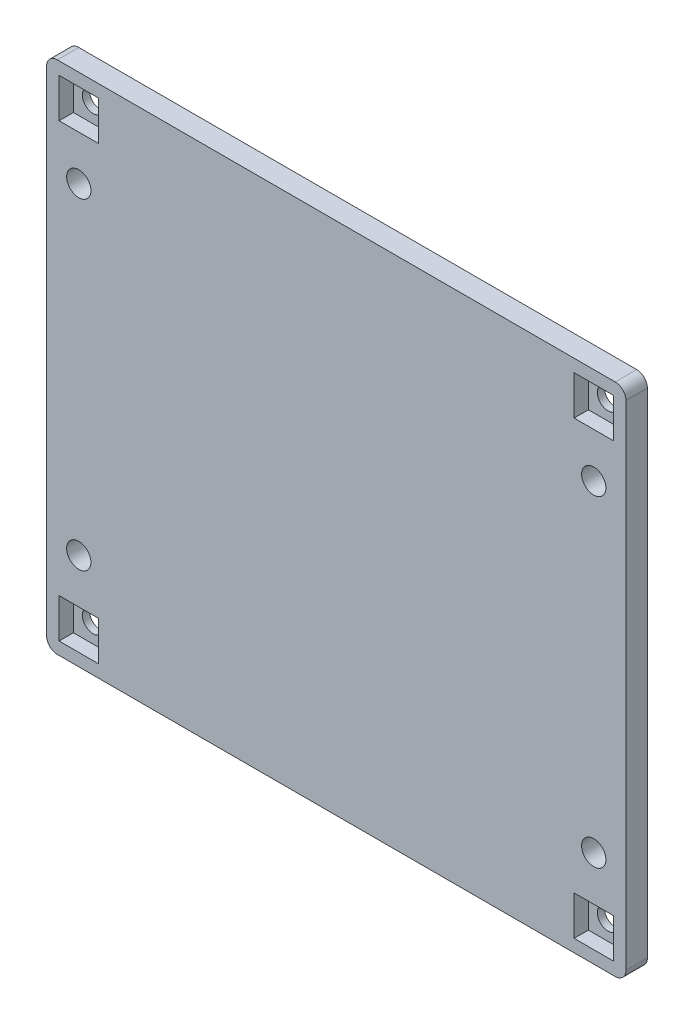
ISO-10303-21;
HEADER;
FILE_DESCRIPTION(('STEP AP214'),'2;1');
FILE_NAME('part.step','',(''),(''),'','','');
FILE_SCHEMA(('AUTOMOTIVE_DESIGN { 1 0 10303 214 1 1 1 1 }'));
ENDSEC;
DATA;
#1=APPLICATION_CONTEXT('core data for automotive mechanical design processes');
#2=APPLICATION_PROTOCOL_DEFINITION('international standard','automotive_design',2000,#1);
#3=PRODUCT_CONTEXT('',#1,'mechanical');
#4=PRODUCT('Part','Part','',(#3));
#5=PRODUCT_RELATED_PRODUCT_CATEGORY('part','',(#4));
#6=PRODUCT_DEFINITION_FORMATION('','',#4);
#7=PRODUCT_DEFINITION_CONTEXT('part definition',#1,'design');
#8=PRODUCT_DEFINITION('design','',#6,#7);
#9=PRODUCT_DEFINITION_SHAPE('','',#8);
#10=(LENGTH_UNIT() NAMED_UNIT(*) SI_UNIT(.MILLI.,.METRE.));
#11=(NAMED_UNIT(*) PLANE_ANGLE_UNIT() SI_UNIT($,.RADIAN.));
#12=(NAMED_UNIT(*) SI_UNIT($,.STERADIAN.) SOLID_ANGLE_UNIT());
#13=UNCERTAINTY_MEASURE_WITH_UNIT(LENGTH_MEASURE(1.E-05),#10,'distance_accuracy_value','');
#14=(GEOMETRIC_REPRESENTATION_CONTEXT(3) GLOBAL_UNCERTAINTY_ASSIGNED_CONTEXT((#13)) GLOBAL_UNIT_ASSIGNED_CONTEXT((#10,
#11,#12)) REPRESENTATION_CONTEXT('',''));
#15=CARTESIAN_POINT('',(0.,0.,0.));
#16=DIRECTION('',(0.,0.,1.));
#17=DIRECTION('',(1.,0.,0.));
#18=AXIS2_PLACEMENT_3D('',#15,#16,#17);
#19=CARTESIAN_POINT('',(82.48303636,231.7459430417,3.));
#20=DIRECTION('',(0.,0.,-1.));
#21=DIRECTION('',(-1.,0.,0.));
#22=AXIS2_PLACEMENT_3D('',#19,#20,#21);
#23=CYLINDRICAL_SURFACE('',#22,1.5);
#24=CARTESIAN_POINT('',(82.48303636,231.7459430417,0.));
#25=DIRECTION('',(0.,0.,1.));
#26=DIRECTION('',(1.,0.,0.));
#27=AXIS2_PLACEMENT_3D('',#24,#25,#26);
#28=CIRCLE('',#27,1.5);
#29=CARTESIAN_POINT('',(83.98303636,231.7459430417,0.));
#30=VERTEX_POINT('',#29);
#31=EDGE_CURVE('E358',#30,#30,#28,.T.);
#32=ORIENTED_EDGE('',*,*,#31,.F.);
#33=EDGE_LOOP('',(#32));
#34=FACE_BOUND('',#33,.T.);
#35=CARTESIAN_POINT('',(82.48303636,231.7459430417,1.));
#36=DIRECTION('',(0.,0.,1.));
#37=DIRECTION('',(1.,0.,0.));
#38=AXIS2_PLACEMENT_3D('',#35,#36,#37);
#39=CIRCLE('',#38,1.5);
#40=CARTESIAN_POINT('',(83.98303636,231.7459430417,1.));
#41=VERTEX_POINT('',#40);
#42=EDGE_CURVE('E37',#41,#41,#39,.T.);
#43=ORIENTED_EDGE('',*,*,#42,.T.);
#44=EDGE_LOOP('',(#43));
#45=FACE_BOUND('',#44,.T.);
#46=ADVANCED_FACE('F33',(#34,#45),#23,.F.);
#47=CARTESIAN_POINT('',(10.478092,294.7486817781,3.));
#48=DIRECTION('',(0.,0.,-1.));
#49=DIRECTION('',(-1.,0.,0.));
#50=AXIS2_PLACEMENT_3D('',#47,#48,#49);
#51=CYLINDRICAL_SURFACE('',#50,1.5);
#52=CARTESIAN_POINT('',(10.478092,294.7486817781,0.));
#53=DIRECTION('',(0.,0.,1.));
#54=DIRECTION('',(1.,0.,0.));
#55=AXIS2_PLACEMENT_3D('',#52,#53,#54);
#56=CIRCLE('',#55,1.5);
#57=CARTESIAN_POINT('',(11.978092,294.7486817781,0.));
#58=VERTEX_POINT('',#57);
#59=EDGE_CURVE('E353',#58,#58,#56,.T.);
#60=ORIENTED_EDGE('',*,*,#59,.F.);
#61=EDGE_LOOP('',(#60));
#62=FACE_BOUND('',#61,.T.);
#63=CARTESIAN_POINT('',(10.478092,294.7486817781,1.));
#64=DIRECTION('',(0.,0.,1.));
#65=DIRECTION('',(1.,0.,0.));
#66=AXIS2_PLACEMENT_3D('',#63,#64,#65);
#67=CIRCLE('',#66,1.5);
#68=CARTESIAN_POINT('',(11.978092,294.7486817781,1.));
#69=VERTEX_POINT('',#68);
#70=EDGE_CURVE('E324',#69,#69,#67,.T.);
#71=ORIENTED_EDGE('',*,*,#70,.T.);
#72=EDGE_LOOP('',(#71));
#73=FACE_BOUND('',#72,.T.);
#74=ADVANCED_FACE('F467',(#62,#73),#51,.F.);
#75=CARTESIAN_POINT('',(7.478092,297.7486817781,3.));
#76=DIRECTION('',(0.,0.,1.));
#77=DIRECTION('',(1.,0.,0.));
#78=AXIS2_PLACEMENT_3D('',#75,#76,#77);
#79=PLANE('',#78);
#80=DIRECTION('',(0.,1.,0.));
#81=VECTOR('',#80,1.);
#82=CARTESIAN_POINT('',(85.23303636,234.4959430417,3.));
#83=LINE('',#82,#81);
#84=CARTESIAN_POINT('',(85.23303636,228.9959430417,3.));
#85=VERTEX_POINT('',#84);
#86=CARTESIAN_POINT('',(85.23303636,234.4959430417,3.));
#87=VERTEX_POINT('',#86);
#88=EDGE_CURVE('E50',#85,#87,#83,.T.);
#89=ORIENTED_EDGE('',*,*,#88,.F.);
#90=DIRECTION('',(1.,0.,0.));
#91=VECTOR('',#90,1.);
#92=CARTESIAN_POINT('',(79.73303636,228.9959430417,3.));
#93=LINE('',#92,#91);
#94=CARTESIAN_POINT('',(79.73303636,228.9959430417,3.));
#95=VERTEX_POINT('',#94);
#96=EDGE_CURVE('E216',#95,#85,#93,.T.);
#97=ORIENTED_EDGE('',*,*,#96,.F.);
#98=DIRECTION('',(0.,-1.,0.));
#99=VECTOR('',#98,1.);
#100=CARTESIAN_POINT('',(79.73303636,234.4959430417,3.));
#101=LINE('',#100,#99);
#102=CARTESIAN_POINT('',(79.73303636,234.4959430417,3.));
#103=VERTEX_POINT('',#102);
#104=EDGE_CURVE('E219',#103,#95,#101,.T.);
#105=ORIENTED_EDGE('',*,*,#104,.F.);
#106=DIRECTION('',(-1.,0.,0.));
#107=VECTOR('',#106,1.);
#108=CARTESIAN_POINT('',(79.73303636,234.4959430417,3.));
#109=LINE('',#108,#107);
#110=EDGE_CURVE('E225',#87,#103,#109,.T.);
#111=ORIENTED_EDGE('',*,*,#110,.F.);
#112=EDGE_LOOP('',(#89,#97,#105,#111));
#113=FACE_BOUND('',#112,.T.);
#114=DIRECTION('',(0.,-1.,0.));
#115=VECTOR('',#114,1.);
#116=CARTESIAN_POINT('',(7.72809199999999,234.4959430417,3.));
#117=LINE('',#116,#115);
#118=CARTESIAN_POINT('',(7.72809199999999,234.4959430417,3.));
#119=VERTEX_POINT('',#118);
#120=CARTESIAN_POINT('',(7.72809199999999,228.9959430417,3.));
#121=VERTEX_POINT('',#120);
#122=EDGE_CURVE('E58',#119,#121,#117,.T.);
#123=ORIENTED_EDGE('',*,*,#122,.F.);
#124=DIRECTION('',(-1.,0.,0.));
#125=VECTOR('',#124,1.);
#126=CARTESIAN_POINT('',(13.228092,234.4959430417,3.));
#127=LINE('',#126,#125);
#128=CARTESIAN_POINT('',(13.228092,234.4959430417,3.));
#129=VERTEX_POINT('',#128);
#130=EDGE_CURVE('E238',#129,#119,#127,.T.);
#131=ORIENTED_EDGE('',*,*,#130,.F.);
#132=DIRECTION('',(0.,1.,0.));
#133=VECTOR('',#132,1.);
#134=CARTESIAN_POINT('',(13.228092,234.4959430417,3.));
#135=LINE('',#134,#133);
#136=CARTESIAN_POINT('',(13.228092,228.9959430417,3.));
#137=VERTEX_POINT('',#136);
#138=EDGE_CURVE('E252',#137,#129,#135,.T.);
#139=ORIENTED_EDGE('',*,*,#138,.F.);
#140=DIRECTION('',(1.,0.,0.));
#141=VECTOR('',#140,1.);
#142=CARTESIAN_POINT('',(13.228092,228.9959430417,3.));
#143=LINE('',#142,#141);
#144=EDGE_CURVE('E249',#121,#137,#143,.T.);
#145=ORIENTED_EDGE('',*,*,#144,.F.);
#146=EDGE_LOOP('',(#123,#131,#139,#145));
#147=FACE_BOUND('',#146,.T.);
#148=DIRECTION('',(0.,-1.,0.));
#149=VECTOR('',#148,1.);
#150=CARTESIAN_POINT('',(79.73303636,297.4986817781,3.));
#151=LINE('',#150,#149);
#152=CARTESIAN_POINT('',(79.73303636,297.4986817781,3.));
#153=VERTEX_POINT('',#152);
#154=CARTESIAN_POINT('',(79.73303636,291.9986817781,3.));
#155=VERTEX_POINT('',#154);
#156=EDGE_CURVE('E279',#153,#155,#151,.T.);
#157=ORIENTED_EDGE('',*,*,#156,.F.);
#158=DIRECTION('',(-1.,0.,0.));
#159=VECTOR('',#158,1.);
#160=CARTESIAN_POINT('',(85.23303636,297.4986817781,3.));
#161=LINE('',#160,#159);
#162=CARTESIAN_POINT('',(85.23303636,297.4986817781,3.));
#163=VERTEX_POINT('',#162);
#164=EDGE_CURVE('E269',#163,#153,#161,.T.);
#165=ORIENTED_EDGE('',*,*,#164,.F.);
#166=DIRECTION('',(0.,1.,0.));
#167=VECTOR('',#166,1.);
#168=CARTESIAN_POINT('',(85.23303636,297.4986817781,3.));
#169=LINE('',#168,#167);
#170=CARTESIAN_POINT('',(85.23303636,291.9986817781,3.));
#171=VERTEX_POINT('',#170);
#172=EDGE_CURVE('E284',#171,#163,#169,.T.);
#173=ORIENTED_EDGE('',*,*,#172,.F.);
#174=DIRECTION('',(1.,0.,0.));
#175=VECTOR('',#174,1.);
#176=CARTESIAN_POINT('',(85.23303636,291.9986817781,3.));
#177=LINE('',#176,#175);
#178=EDGE_CURVE('E281',#155,#171,#177,.T.);
#179=ORIENTED_EDGE('',*,*,#178,.F.);
#180=EDGE_LOOP('',(#157,#165,#173,#179));
#181=FACE_BOUND('',#180,.T.);
#182=DIRECTION('',(0.,1.,0.));
#183=VECTOR('',#182,1.);
#184=CARTESIAN_POINT('',(13.228092,297.4986817781,3.));
#185=LINE('',#184,#183);
#186=CARTESIAN_POINT('',(13.228092,291.9986817781,3.));
#187=VERTEX_POINT('',#186);
#188=CARTESIAN_POINT('',(13.228092,297.4986817781,3.));
#189=VERTEX_POINT('',#188);
#190=EDGE_CURVE('E312',#187,#189,#185,.T.);
#191=ORIENTED_EDGE('',*,*,#190,.F.);
#192=DIRECTION('',(1.,0.,0.));
#193=VECTOR('',#192,1.);
#194=CARTESIAN_POINT('',(7.728092,291.9986817781,3.));
#195=LINE('',#194,#193);
#196=CARTESIAN_POINT('',(7.728092,291.9986817781,3.));
#197=VERTEX_POINT('',#196);
#198=EDGE_CURVE('E302',#197,#187,#195,.T.);
#199=ORIENTED_EDGE('',*,*,#198,.F.);
#200=DIRECTION('',(0.,-1.,0.));
#201=VECTOR('',#200,1.);
#202=CARTESIAN_POINT('',(7.728092,297.4986817781,3.));
#203=LINE('',#202,#201);
#204=CARTESIAN_POINT('',(7.728092,297.4986817781,3.));
#205=VERTEX_POINT('',#204);
#206=EDGE_CURVE('E317',#205,#197,#203,.T.);
#207=ORIENTED_EDGE('',*,*,#206,.F.);
#208=DIRECTION('',(-1.,0.,0.));
#209=VECTOR('',#208,1.);
#210=CARTESIAN_POINT('',(7.728092,297.4986817781,3.));
#211=LINE('',#210,#209);
#212=EDGE_CURVE('E314',#189,#205,#211,.T.);
#213=ORIENTED_EDGE('',*,*,#212,.F.);
#214=EDGE_LOOP('',(#191,#199,#207,#213));
#215=FACE_BOUND('',#214,.T.);
#216=CARTESIAN_POINT('',(82.48303636,240.7456085396,3.));
#217=DIRECTION('',(0.,0.,1.));
#218=DIRECTION('',(1.,0.,0.));
#219=AXIS2_PLACEMENT_3D('',#216,#217,#218);
#220=CIRCLE('',#219,1.69999999999999);
#221=CARTESIAN_POINT('',(84.18303636,240.7456085396,3.));
#222=VERTEX_POINT('',#221);
#223=EDGE_CURVE('E338',#222,#222,#220,.T.);
#224=ORIENTED_EDGE('',*,*,#223,.F.);
#225=EDGE_LOOP('',(#224));
#226=FACE_BOUND('',#225,.T.);
#227=CARTESIAN_POINT('',(10.478092,240.7456085396,3.));
#228=DIRECTION('',(0.,0.,1.));
#229=DIRECTION('',(1.,0.,0.));
#230=AXIS2_PLACEMENT_3D('',#227,#228,#229);
#231=CIRCLE('',#230,1.7);
#232=CARTESIAN_POINT('',(12.178092,240.7456085396,3.));
#233=VERTEX_POINT('',#232);
#234=EDGE_CURVE('E350',#233,#233,#231,.T.);
#235=ORIENTED_EDGE('',*,*,#234,.F.);
#236=EDGE_LOOP('',(#235));
#237=FACE_BOUND('',#236,.T.);
#238=CARTESIAN_POINT('',(7.478092,297.7486817781,3.));
#239=DIRECTION('',(0.,0.,1.));
#240=DIRECTION('',(1.,0.,0.));
#241=AXIS2_PLACEMENT_3D('',#238,#239,#240);
#242=CIRCLE('',#241,1.5);
#243=CARTESIAN_POINT('',(7.478092,299.2486817781,3.));
#244=VERTEX_POINT('',#243);
#245=CARTESIAN_POINT('',(5.978092,297.7486817781,3.));
#246=VERTEX_POINT('',#245);
#247=EDGE_CURVE('E368',#244,#246,#242,.T.);
#248=ORIENTED_EDGE('',*,*,#247,.T.);
#249=DIRECTION('',(0.,-1.,0.));
#250=VECTOR('',#249,1.);
#251=CARTESIAN_POINT('',(5.978092,228.7462775439,3.));
#252=LINE('',#251,#250);
#253=CARTESIAN_POINT('',(5.978092,228.7462775439,3.));
#254=VERTEX_POINT('',#253);
#255=EDGE_CURVE('E371',#246,#254,#252,.T.);
#256=ORIENTED_EDGE('',*,*,#255,.T.);
#257=CARTESIAN_POINT('',(7.478092,228.7462775439,3.));
#258=DIRECTION('',(0.,0.,1.));
#259=DIRECTION('',(1.,0.,0.));
#260=AXIS2_PLACEMENT_3D('',#257,#258,#259);
#261=CIRCLE('',#260,1.5);
#262=CARTESIAN_POINT('',(7.478092,227.2462775439,3.));
#263=VERTEX_POINT('',#262);
#264=EDGE_CURVE('E374',#254,#263,#261,.T.);
#265=ORIENTED_EDGE('',*,*,#264,.T.);
#266=DIRECTION('',(1.,0.,0.));
#267=VECTOR('',#266,1.);
#268=CARTESIAN_POINT('',(85.4827018578,227.2462775439,3.));
#269=LINE('',#268,#267);
#270=CARTESIAN_POINT('',(85.4827018578,227.2462775439,3.));
#271=VERTEX_POINT('',#270);
#272=EDGE_CURVE('E376',#263,#271,#269,.T.);
#273=ORIENTED_EDGE('',*,*,#272,.T.);
#274=CARTESIAN_POINT('',(85.4827018578,228.7462775439,3.));
#275=DIRECTION('',(0.,0.,1.));
#276=DIRECTION('',(1.,0.,0.));
#277=AXIS2_PLACEMENT_3D('',#274,#275,#276);
#278=CIRCLE('',#277,1.5);
#279=CARTESIAN_POINT('',(86.9827018578,228.7462775439,3.));
#280=VERTEX_POINT('',#279);
#281=EDGE_CURVE('E378',#271,#280,#278,.T.);
#282=ORIENTED_EDGE('',*,*,#281,.T.);
#283=DIRECTION('',(0.,1.,0.));
#284=VECTOR('',#283,1.);
#285=CARTESIAN_POINT('',(86.9827018578,297.7486817781,3.));
#286=LINE('',#285,#284);
#287=CARTESIAN_POINT('',(86.9827018578,297.7486817781,3.));
#288=VERTEX_POINT('',#287);
#289=EDGE_CURVE('E380',#280,#288,#286,.T.);
#290=ORIENTED_EDGE('',*,*,#289,.T.);
#291=CARTESIAN_POINT('',(85.4827018578,297.7486817781,3.));
#292=DIRECTION('',(0.,0.,1.));
#293=DIRECTION('',(1.,0.,0.));
#294=AXIS2_PLACEMENT_3D('',#291,#292,#293);
#295=CIRCLE('',#294,1.5);
#296=CARTESIAN_POINT('',(85.4827018578,299.2486817781,3.));
#297=VERTEX_POINT('',#296);
#298=EDGE_CURVE('E382',#288,#297,#295,.T.);
#299=ORIENTED_EDGE('',*,*,#298,.T.);
#300=DIRECTION('',(-1.,0.,0.));
#301=VECTOR('',#300,1.);
#302=CARTESIAN_POINT('',(7.478092,299.2486817781,3.));
#303=LINE('',#302,#301);
#304=EDGE_CURVE('E384',#297,#244,#303,.T.);
#305=ORIENTED_EDGE('',*,*,#304,.T.);
#306=EDGE_LOOP('',(#248,#256,#265,#273,#282,#290,#299,#305));
#307=FACE_BOUND('',#306,.T.);
#308=CARTESIAN_POINT('',(10.478092,285.7490162803,3.));
#309=DIRECTION('',(0.,0.,1.));
#310=DIRECTION('',(1.,0.,0.));
#311=AXIS2_PLACEMENT_3D('',#308,#309,#310);
#312=CIRCLE('',#311,1.7);
#313=CARTESIAN_POINT('',(12.178092,285.7490162803,3.));
#314=VERTEX_POINT('',#313);
#315=EDGE_CURVE('E344',#314,#314,#312,.T.);
#316=ORIENTED_EDGE('',*,*,#315,.F.);
#317=EDGE_LOOP('',(#316));
#318=FACE_BOUND('',#317,.T.);
#319=CARTESIAN_POINT('',(82.48303636,285.7490162803,3.));
#320=DIRECTION('',(0.,0.,1.));
#321=DIRECTION('',(1.,0.,0.));
#322=AXIS2_PLACEMENT_3D('',#319,#320,#321);
#323=CIRCLE('',#322,1.69999999999999);
#324=CARTESIAN_POINT('',(84.18303636,285.7490162803,3.));
#325=VERTEX_POINT('',#324);
#326=EDGE_CURVE('E331',#325,#325,#323,.T.);
#327=ORIENTED_EDGE('',*,*,#326,.F.);
#328=EDGE_LOOP('',(#327));
#329=FACE_BOUND('',#328,.T.);
#330=ADVANCED_FACE('F441',(#113,#147,#181,#215,#226,#237,#307,#318,#329),#79,.T.);
#331=CARTESIAN_POINT('',(7.478092,297.7486817781,0.));
#332=DIRECTION('',(0.,0.,1.));
#333=DIRECTION('',(1.,0.,0.));
#334=AXIS2_PLACEMENT_3D('',#331,#332,#333);
#335=PLANE('',#334);
#336=CARTESIAN_POINT('',(82.48303636,240.7456085396,0.));
#337=DIRECTION('',(0.,0.,1.));
#338=DIRECTION('',(1.,0.,0.));
#339=AXIS2_PLACEMENT_3D('',#336,#337,#338);
#340=CIRCLE('',#339,1.69999999999999);
#341=CARTESIAN_POINT('',(84.18303636,240.7456085396,0.));
#342=VERTEX_POINT('',#341);
#343=EDGE_CURVE('E334',#342,#342,#340,.T.);
#344=ORIENTED_EDGE('',*,*,#343,.T.);
#345=EDGE_LOOP('',(#344));
#346=FACE_BOUND('',#345,.T.);
#347=CARTESIAN_POINT('',(10.478092,240.7456085396,0.));
#348=DIRECTION('',(0.,0.,1.));
#349=DIRECTION('',(1.,0.,0.));
#350=AXIS2_PLACEMENT_3D('',#347,#348,#349);
#351=CIRCLE('',#350,1.7);
#352=CARTESIAN_POINT('',(12.178092,240.7456085396,0.));
#353=VERTEX_POINT('',#352);
#354=EDGE_CURVE('E347',#353,#353,#351,.T.);
#355=ORIENTED_EDGE('',*,*,#354,.T.);
#356=EDGE_LOOP('',(#355));
#357=FACE_BOUND('',#356,.T.);
#358=ORIENTED_EDGE('',*,*,#31,.T.);
#359=EDGE_LOOP('',(#358));
#360=FACE_BOUND('',#359,.T.);
#361=CARTESIAN_POINT('',(82.48303636,294.7486817781,0.));
#362=DIRECTION('',(0.,0.,1.));
#363=DIRECTION('',(1.,0.,0.));
#364=AXIS2_PLACEMENT_3D('',#361,#362,#363);
#365=CIRCLE('',#364,1.5);
#366=CARTESIAN_POINT('',(83.98303636,294.7486817781,0.));
#367=VERTEX_POINT('',#366);
#368=EDGE_CURVE('E364',#367,#367,#365,.T.);
#369=ORIENTED_EDGE('',*,*,#368,.T.);
#370=EDGE_LOOP('',(#369));
#371=FACE_BOUND('',#370,.T.);
#372=CARTESIAN_POINT('',(7.478092,297.7486817781,0.));
#373=DIRECTION('',(0.,0.,1.));
#374=DIRECTION('',(1.,0.,0.));
#375=AXIS2_PLACEMENT_3D('',#372,#373,#374);
#376=CIRCLE('',#375,1.5);
#377=CARTESIAN_POINT('',(7.478092,299.2486817781,0.));
#378=VERTEX_POINT('',#377);
#379=CARTESIAN_POINT('',(5.978092,297.7486817781,0.));
#380=VERTEX_POINT('',#379);
#381=EDGE_CURVE('E367',#378,#380,#376,.T.);
#382=ORIENTED_EDGE('',*,*,#381,.F.);
#383=DIRECTION('',(-1.,0.,0.));
#384=VECTOR('',#383,1.);
#385=CARTESIAN_POINT('',(7.478092,299.2486817781,0.));
#386=LINE('',#385,#384);
#387=CARTESIAN_POINT('',(85.4827018578,299.2486817781,0.));
#388=VERTEX_POINT('',#387);
#389=EDGE_CURVE('E372',#388,#378,#386,.T.);
#390=ORIENTED_EDGE('',*,*,#389,.F.);
#391=CARTESIAN_POINT('',(85.4827018578,297.7486817781,0.));
#392=DIRECTION('',(0.,0.,1.));
#393=DIRECTION('',(1.,0.,0.));
#394=AXIS2_PLACEMENT_3D('',#391,#392,#393);
#395=CIRCLE('',#394,1.5);
#396=CARTESIAN_POINT('',(86.9827018578,297.7486817781,0.));
#397=VERTEX_POINT('',#396);
#398=EDGE_CURVE('E399',#397,#388,#395,.T.);
#399=ORIENTED_EDGE('',*,*,#398,.F.);
#400=DIRECTION('',(0.,1.,0.));
#401=VECTOR('',#400,1.);
#402=CARTESIAN_POINT('',(86.9827018578,297.7486817781,0.));
#403=LINE('',#402,#401);
#404=CARTESIAN_POINT('',(86.9827018578,228.7462775439,0.));
#405=VERTEX_POINT('',#404);
#406=EDGE_CURVE('E397',#405,#397,#403,.T.);
#407=ORIENTED_EDGE('',*,*,#406,.F.);
#408=CARTESIAN_POINT('',(85.4827018578,228.7462775439,0.));
#409=DIRECTION('',(0.,0.,1.));
#410=DIRECTION('',(1.,0.,0.));
#411=AXIS2_PLACEMENT_3D('',#408,#409,#410);
#412=CIRCLE('',#411,1.5);
#413=CARTESIAN_POINT('',(85.4827018578,227.2462775439,0.));
#414=VERTEX_POINT('',#413);
#415=EDGE_CURVE('E395',#414,#405,#412,.T.);
#416=ORIENTED_EDGE('',*,*,#415,.F.);
#417=DIRECTION('',(1.,0.,0.));
#418=VECTOR('',#417,1.);
#419=CARTESIAN_POINT('',(85.4827018578,227.2462775439,0.));
#420=LINE('',#419,#418);
#421=CARTESIAN_POINT('',(7.478092,227.2462775439,0.));
#422=VERTEX_POINT('',#421);
#423=EDGE_CURVE('E393',#422,#414,#420,.T.);
#424=ORIENTED_EDGE('',*,*,#423,.F.);
#425=CARTESIAN_POINT('',(7.478092,228.7462775439,0.));
#426=DIRECTION('',(0.,0.,1.));
#427=DIRECTION('',(1.,0.,0.));
#428=AXIS2_PLACEMENT_3D('',#425,#426,#427);
#429=CIRCLE('',#428,1.5);
#430=CARTESIAN_POINT('',(5.978092,228.7462775439,0.));
#431=VERTEX_POINT('',#430);
#432=EDGE_CURVE('E391',#431,#422,#429,.T.);
#433=ORIENTED_EDGE('',*,*,#432,.F.);
#434=DIRECTION('',(0.,-1.,0.));
#435=VECTOR('',#434,1.);
#436=CARTESIAN_POINT('',(5.978092,228.7462775439,0.));
#437=LINE('',#436,#435);
#438=EDGE_CURVE('E389',#380,#431,#437,.T.);
#439=ORIENTED_EDGE('',*,*,#438,.F.);
#440=EDGE_LOOP('',(#382,#390,#399,#407,#416,#424,#433,#439));
#441=FACE_BOUND('',#440,.T.);
#442=CARTESIAN_POINT('',(10.478092,231.7459430417,0.));
#443=DIRECTION('',(0.,0.,1.));
#444=DIRECTION('',(1.,0.,0.));
#445=AXIS2_PLACEMENT_3D('',#442,#443,#444);
#446=CIRCLE('',#445,1.5);
#447=CARTESIAN_POINT('',(11.978092,231.7459430417,0.));
#448=VERTEX_POINT('',#447);
#449=EDGE_CURVE('E361',#448,#448,#446,.T.);
#450=ORIENTED_EDGE('',*,*,#449,.T.);
#451=EDGE_LOOP('',(#450));
#452=FACE_BOUND('',#451,.T.);
#453=ORIENTED_EDGE('',*,*,#59,.T.);
#454=EDGE_LOOP('',(#453));
#455=FACE_BOUND('',#454,.T.);
#456=CARTESIAN_POINT('',(10.478092,285.7490162803,0.));
#457=DIRECTION('',(0.,0.,1.));
#458=DIRECTION('',(1.,0.,0.));
#459=AXIS2_PLACEMENT_3D('',#456,#457,#458);
#460=CIRCLE('',#459,1.7);
#461=CARTESIAN_POINT('',(12.178092,285.7490162803,0.));
#462=VERTEX_POINT('',#461);
#463=EDGE_CURVE('E341',#462,#462,#460,.T.);
#464=ORIENTED_EDGE('',*,*,#463,.T.);
#465=EDGE_LOOP('',(#464));
#466=FACE_BOUND('',#465,.T.);
#467=CARTESIAN_POINT('',(82.48303636,285.7490162803,0.));
#468=DIRECTION('',(0.,0.,1.));
#469=DIRECTION('',(1.,0.,0.));
#470=AXIS2_PLACEMENT_3D('',#467,#468,#469);
#471=CIRCLE('',#470,1.69999999999999);
#472=CARTESIAN_POINT('',(84.18303636,285.7490162803,0.));
#473=VERTEX_POINT('',#472);
#474=EDGE_CURVE('E335',#473,#473,#471,.T.);
#475=ORIENTED_EDGE('',*,*,#474,.T.);
#476=EDGE_LOOP('',(#475));
#477=FACE_BOUND('',#476,.T.);
#478=ADVANCED_FACE('F438',(#346,#357,#360,#371,#441,#452,#455,#466,#477),#335,.F.);
#479=CARTESIAN_POINT('',(7.478092,297.7486817781,3.));
#480=DIRECTION('',(0.,0.,-1.));
#481=DIRECTION('',(-1.,0.,0.));
#482=AXIS2_PLACEMENT_3D('',#479,#480,#481);
#483=CYLINDRICAL_SURFACE('',#482,1.5);
#484=ORIENTED_EDGE('',*,*,#381,.T.);
#485=DIRECTION('',(0.,0.,-1.));
#486=VECTOR('',#485,1.);
#487=CARTESIAN_POINT('',(5.978092,297.7486817781,3.));
#488=LINE('',#487,#486);
#489=EDGE_CURVE('E11',#246,#380,#488,.T.);
#490=ORIENTED_EDGE('',*,*,#489,.F.);
#491=ORIENTED_EDGE('',*,*,#247,.F.);
#492=DIRECTION('',(0.,0.,-1.));
#493=VECTOR('',#492,1.);
#494=CARTESIAN_POINT('',(7.478092,299.2486817781,3.));
#495=LINE('',#494,#493);
#496=EDGE_CURVE('E386',#244,#378,#495,.T.);
#497=ORIENTED_EDGE('',*,*,#496,.T.);
#498=EDGE_LOOP('',(#484,#490,#491,#497));
#499=FACE_BOUND('',#498,.T.);
#500=ADVANCED_FACE('F35',(#499),#483,.T.);
#501=CARTESIAN_POINT('',(5.978092,228.7462775439,3.));
#502=DIRECTION('',(1.,0.,0.));
#503=DIRECTION('',(0.,0.,-1.));
#504=AXIS2_PLACEMENT_3D('',#501,#502,#503);
#505=PLANE('',#504);
#506=ORIENTED_EDGE('',*,*,#438,.T.);
#507=DIRECTION('',(0.,0.,-1.));
#508=VECTOR('',#507,1.);
#509=CARTESIAN_POINT('',(5.978092,228.7462775439,3.));
#510=LINE('',#509,#508);
#511=EDGE_CURVE('E42',#254,#431,#510,.T.);
#512=ORIENTED_EDGE('',*,*,#511,.F.);
#513=ORIENTED_EDGE('',*,*,#255,.F.);
#514=ORIENTED_EDGE('',*,*,#489,.T.);
#515=EDGE_LOOP('',(#506,#512,#513,#514));
#516=FACE_BOUND('',#515,.T.);
#517=ADVANCED_FACE('F507',(#516),#505,.F.);
#518=CARTESIAN_POINT('',(7.478092,228.7462775439,3.));
#519=DIRECTION('',(0.,0.,-1.));
#520=DIRECTION('',(-1.,0.,0.));
#521=AXIS2_PLACEMENT_3D('',#518,#519,#520);
#522=CYLINDRICAL_SURFACE('',#521,1.5);
#523=ORIENTED_EDGE('',*,*,#432,.T.);
#524=DIRECTION('',(0.,0.,-1.));
#525=VECTOR('',#524,1.);
#526=CARTESIAN_POINT('',(7.478092,227.2462775439,3.));
#527=LINE('',#526,#525);
#528=EDGE_CURVE('E416',#263,#422,#527,.T.);
#529=ORIENTED_EDGE('',*,*,#528,.F.);
#530=ORIENTED_EDGE('',*,*,#264,.F.);
#531=ORIENTED_EDGE('',*,*,#511,.T.);
#532=EDGE_LOOP('',(#523,#529,#530,#531));
#533=FACE_BOUND('',#532,.T.);
#534=ADVANCED_FACE('F504',(#533),#522,.T.);
#535=CARTESIAN_POINT('',(85.4827018578,227.2462775439,3.));
#536=DIRECTION('',(0.,1.,0.));
#537=DIRECTION('',(0.,0.,1.));
#538=AXIS2_PLACEMENT_3D('',#535,#536,#537);
#539=PLANE('',#538);
#540=ORIENTED_EDGE('',*,*,#423,.T.);
#541=DIRECTION('',(0.,0.,-1.));
#542=VECTOR('',#541,1.);
#543=CARTESIAN_POINT('',(85.4827018578,227.2462775439,3.));
#544=LINE('',#543,#542);
#545=EDGE_CURVE('E413',#271,#414,#544,.T.);
#546=ORIENTED_EDGE('',*,*,#545,.F.);
#547=ORIENTED_EDGE('',*,*,#272,.F.);
#548=ORIENTED_EDGE('',*,*,#528,.T.);
#549=EDGE_LOOP('',(#540,#546,#547,#548));
#550=FACE_BOUND('',#549,.T.);
#551=ADVANCED_FACE('F500',(#550),#539,.F.);
#552=CARTESIAN_POINT('',(85.4827018578,228.7462775439,3.));
#553=DIRECTION('',(0.,0.,-1.));
#554=DIRECTION('',(-1.,0.,0.));
#555=AXIS2_PLACEMENT_3D('',#552,#553,#554);
#556=CYLINDRICAL_SURFACE('',#555,1.5);
#557=ORIENTED_EDGE('',*,*,#415,.T.);
#558=DIRECTION('',(0.,0.,-1.));
#559=VECTOR('',#558,1.);
#560=CARTESIAN_POINT('',(86.9827018578,228.7462775439,3.));
#561=LINE('',#560,#559);
#562=EDGE_CURVE('E410',#280,#405,#561,.T.);
#563=ORIENTED_EDGE('',*,*,#562,.F.);
#564=ORIENTED_EDGE('',*,*,#281,.F.);
#565=ORIENTED_EDGE('',*,*,#545,.T.);
#566=EDGE_LOOP('',(#557,#563,#564,#565));
#567=FACE_BOUND('',#566,.T.);
#568=ADVANCED_FACE('F496',(#567),#556,.T.);
#569=CARTESIAN_POINT('',(86.9827018578,297.7486817781,3.));
#570=DIRECTION('',(-1.,0.,0.));
#571=DIRECTION('',(0.,0.,1.));
#572=AXIS2_PLACEMENT_3D('',#569,#570,#571);
#573=PLANE('',#572);
#574=ORIENTED_EDGE('',*,*,#406,.T.);
#575=DIRECTION('',(0.,0.,-1.));
#576=VECTOR('',#575,1.);
#577=CARTESIAN_POINT('',(86.9827018578,297.7486817781,3.));
#578=LINE('',#577,#576);
#579=EDGE_CURVE('E407',#288,#397,#578,.T.);
#580=ORIENTED_EDGE('',*,*,#579,.F.);
#581=ORIENTED_EDGE('',*,*,#289,.F.);
#582=ORIENTED_EDGE('',*,*,#562,.T.);
#583=EDGE_LOOP('',(#574,#580,#581,#582));
#584=FACE_BOUND('',#583,.T.);
#585=ADVANCED_FACE('F492',(#584),#573,.F.);
#586=CARTESIAN_POINT('',(85.4827018578,297.7486817781,3.));
#587=DIRECTION('',(0.,0.,-1.));
#588=DIRECTION('',(-1.,0.,0.));
#589=AXIS2_PLACEMENT_3D('',#586,#587,#588);
#590=CYLINDRICAL_SURFACE('',#589,1.5);
#591=ORIENTED_EDGE('',*,*,#398,.T.);
#592=DIRECTION('',(0.,0.,-1.));
#593=VECTOR('',#592,1.);
#594=CARTESIAN_POINT('',(85.4827018578,299.2486817781,3.));
#595=LINE('',#594,#593);
#596=EDGE_CURVE('E404',#297,#388,#595,.T.);
#597=ORIENTED_EDGE('',*,*,#596,.F.);
#598=ORIENTED_EDGE('',*,*,#298,.F.);
#599=ORIENTED_EDGE('',*,*,#579,.T.);
#600=EDGE_LOOP('',(#591,#597,#598,#599));
#601=FACE_BOUND('',#600,.T.);
#602=ADVANCED_FACE('F488',(#601),#590,.T.);
#603=CARTESIAN_POINT('',(7.478092,299.2486817781,3.));
#604=DIRECTION('',(0.,-1.,0.));
#605=DIRECTION('',(0.,0.,-1.));
#606=AXIS2_PLACEMENT_3D('',#603,#604,#605);
#607=PLANE('',#606);
#608=ORIENTED_EDGE('',*,*,#389,.T.);
#609=ORIENTED_EDGE('',*,*,#496,.F.);
#610=ORIENTED_EDGE('',*,*,#304,.F.);
#611=ORIENTED_EDGE('',*,*,#596,.T.);
#612=EDGE_LOOP('',(#608,#609,#610,#611));
#613=FACE_BOUND('',#612,.T.);
#614=ADVANCED_FACE('F481',(#613),#607,.F.);
#615=CARTESIAN_POINT('',(82.48303636,294.7486817781,3.));
#616=DIRECTION('',(0.,0.,-1.));
#617=DIRECTION('',(-1.,0.,0.));
#618=AXIS2_PLACEMENT_3D('',#615,#616,#617);
#619=CYLINDRICAL_SURFACE('',#618,1.5);
#620=CARTESIAN_POINT('',(82.48303636,294.7486817781,1.));
#621=DIRECTION('',(0.,0.,-1.));
#622=DIRECTION('',(-1.,0.,0.));
#623=AXIS2_PLACEMENT_3D('',#620,#621,#622);
#624=CIRCLE('',#623,1.5);
#625=CARTESIAN_POINT('',(80.98303636,294.7486817781,1.));
#626=VERTEX_POINT('',#625);
#627=EDGE_CURVE('E291',#626,#626,#624,.T.);
#628=ORIENTED_EDGE('',*,*,#627,.F.);
#629=EDGE_LOOP('',(#628));
#630=FACE_BOUND('',#629,.T.);
#631=ORIENTED_EDGE('',*,*,#368,.F.);
#632=EDGE_LOOP('',(#631));
#633=FACE_BOUND('',#632,.T.);
#634=ADVANCED_FACE('F434',(#630,#633),#619,.F.);
#635=CARTESIAN_POINT('',(10.478092,231.7459430417,3.));
#636=DIRECTION('',(0.,0.,-1.));
#637=DIRECTION('',(-1.,0.,0.));
#638=AXIS2_PLACEMENT_3D('',#635,#636,#637);
#639=CYLINDRICAL_SURFACE('',#638,1.5);
#640=CARTESIAN_POINT('',(10.478092,231.7459430417,1.));
#641=DIRECTION('',(0.,0.,-1.));
#642=DIRECTION('',(-1.,0.,0.));
#643=AXIS2_PLACEMENT_3D('',#640,#641,#642);
#644=CIRCLE('',#643,1.5);
#645=CARTESIAN_POINT('',(8.978092,231.7459430417,1.));
#646=VERTEX_POINT('',#645);
#647=EDGE_CURVE('E259',#646,#646,#644,.T.);
#648=ORIENTED_EDGE('',*,*,#647,.F.);
#649=EDGE_LOOP('',(#648));
#650=FACE_BOUND('',#649,.T.);
#651=ORIENTED_EDGE('',*,*,#449,.F.);
#652=EDGE_LOOP('',(#651));
#653=FACE_BOUND('',#652,.T.);
#654=ADVANCED_FACE('F430',(#650,#653),#639,.F.);
#655=CARTESIAN_POINT('',(10.478092,240.7456085396,3.));
#656=DIRECTION('',(0.,0.,-1.));
#657=DIRECTION('',(-1.,0.,0.));
#658=AXIS2_PLACEMENT_3D('',#655,#656,#657);
#659=CYLINDRICAL_SURFACE('',#658,1.7);
#660=ORIENTED_EDGE('',*,*,#234,.T.);
#661=EDGE_LOOP('',(#660));
#662=FACE_BOUND('',#661,.T.);
#663=ORIENTED_EDGE('',*,*,#354,.F.);
#664=EDGE_LOOP('',(#663));
#665=FACE_BOUND('',#664,.T.);
#666=ADVANCED_FACE('F433',(#662,#665),#659,.F.);
#667=CARTESIAN_POINT('',(10.478092,285.7490162803,3.));
#668=DIRECTION('',(0.,0.,-1.));
#669=DIRECTION('',(-1.,0.,0.));
#670=AXIS2_PLACEMENT_3D('',#667,#668,#669);
#671=CYLINDRICAL_SURFACE('',#670,1.7);
#672=ORIENTED_EDGE('',*,*,#315,.T.);
#673=EDGE_LOOP('',(#672));
#674=FACE_BOUND('',#673,.T.);
#675=ORIENTED_EDGE('',*,*,#463,.F.);
#676=EDGE_LOOP('',(#675));
#677=FACE_BOUND('',#676,.T.);
#678=ADVANCED_FACE('F463',(#674,#677),#671,.F.);
#679=CARTESIAN_POINT('',(82.48303636,240.7456085396,3.));
#680=DIRECTION('',(0.,0.,-1.));
#681=DIRECTION('',(-1.,0.,0.));
#682=AXIS2_PLACEMENT_3D('',#679,#680,#681);
#683=CYLINDRICAL_SURFACE('',#682,1.69999999999999);
#684=ORIENTED_EDGE('',*,*,#223,.T.);
#685=EDGE_LOOP('',(#684));
#686=FACE_BOUND('',#685,.T.);
#687=ORIENTED_EDGE('',*,*,#343,.F.);
#688=EDGE_LOOP('',(#687));
#689=FACE_BOUND('',#688,.T.);
#690=ADVANCED_FACE('F453',(#686,#689),#683,.F.);
#691=CARTESIAN_POINT('',(82.48303636,285.7490162803,3.));
#692=DIRECTION('',(0.,0.,-1.));
#693=DIRECTION('',(-1.,0.,0.));
#694=AXIS2_PLACEMENT_3D('',#691,#692,#693);
#695=CYLINDRICAL_SURFACE('',#694,1.69999999999999);
#696=ORIENTED_EDGE('',*,*,#326,.T.);
#697=EDGE_LOOP('',(#696));
#698=FACE_BOUND('',#697,.T.);
#699=ORIENTED_EDGE('',*,*,#474,.F.);
#700=EDGE_LOOP('',(#699));
#701=FACE_BOUND('',#700,.T.);
#702=ADVANCED_FACE('F450',(#698,#701),#695,.F.);
#703=CARTESIAN_POINT('',(13.228092,297.4986817781,1.));
#704=DIRECTION('',(1.,0.,0.));
#705=DIRECTION('',(0.,0.,-1.));
#706=AXIS2_PLACEMENT_3D('',#703,#704,#705);
#707=PLANE('',#706);
#708=ORIENTED_EDGE('',*,*,#190,.T.);
#709=DIRECTION('',(0.,0.,1.));
#710=VECTOR('',#709,1.);
#711=CARTESIAN_POINT('',(13.228092,297.4986817781,1.));
#712=LINE('',#711,#710);
#713=CARTESIAN_POINT('',(13.228092,297.4986817781,1.));
#714=VERTEX_POINT('',#713);
#715=EDGE_CURVE('E311',#714,#189,#712,.T.);
#716=ORIENTED_EDGE('',*,*,#715,.F.);
#717=DIRECTION('',(0.,1.,0.));
#718=VECTOR('',#717,1.);
#719=CARTESIAN_POINT('',(13.228092,297.4986817781,1.));
#720=LINE('',#719,#718);
#721=CARTESIAN_POINT('',(13.228092,291.9986817781,1.));
#722=VERTEX_POINT('',#721);
#723=EDGE_CURVE('E298',#722,#714,#720,.T.);
#724=ORIENTED_EDGE('',*,*,#723,.F.);
#725=DIRECTION('',(0.,0.,1.));
#726=VECTOR('',#725,1.);
#727=CARTESIAN_POINT('',(13.228092,291.9986817781,1.));
#728=LINE('',#727,#726);
#729=EDGE_CURVE('E322',#722,#187,#728,.T.);
#730=ORIENTED_EDGE('',*,*,#729,.T.);
#731=EDGE_LOOP('',(#708,#716,#724,#730));
#732=FACE_BOUND('',#731,.T.);
#733=ADVANCED_FACE('F452',(#732),#707,.F.);
#734=CARTESIAN_POINT('',(7.728092,291.9986817781,1.));
#735=DIRECTION('',(0.,-1.,0.));
#736=DIRECTION('',(0.,0.,-1.));
#737=AXIS2_PLACEMENT_3D('',#734,#735,#736);
#738=PLANE('',#737);
#739=ORIENTED_EDGE('',*,*,#198,.T.);
#740=ORIENTED_EDGE('',*,*,#729,.F.);
#741=DIRECTION('',(1.,0.,0.));
#742=VECTOR('',#741,1.);
#743=CARTESIAN_POINT('',(7.728092,291.9986817781,1.));
#744=LINE('',#743,#742);
#745=CARTESIAN_POINT('',(7.728092,291.9986817781,1.));
#746=VERTEX_POINT('',#745);
#747=EDGE_CURVE('E308',#746,#722,#744,.T.);
#748=ORIENTED_EDGE('',*,*,#747,.F.);
#749=DIRECTION('',(0.,0.,1.));
#750=VECTOR('',#749,1.);
#751=CARTESIAN_POINT('',(7.728092,291.9986817781,1.));
#752=LINE('',#751,#750);
#753=EDGE_CURVE('E325',#746,#197,#752,.T.);
#754=ORIENTED_EDGE('',*,*,#753,.T.);
#755=EDGE_LOOP('',(#739,#740,#748,#754));
#756=FACE_BOUND('',#755,.T.);
#757=ADVANCED_FACE('F460',(#756),#738,.F.);
#758=CARTESIAN_POINT('',(7.728092,297.4986817781,1.));
#759=DIRECTION('',(-1.,0.,0.));
#760=DIRECTION('',(0.,0.,1.));
#761=AXIS2_PLACEMENT_3D('',#758,#759,#760);
#762=PLANE('',#761);
#763=ORIENTED_EDGE('',*,*,#206,.T.);
#764=ORIENTED_EDGE('',*,*,#753,.F.);
#765=DIRECTION('',(0.,-1.,0.));
#766=VECTOR('',#765,1.);
#767=CARTESIAN_POINT('',(7.728092,297.4986817781,1.));
#768=LINE('',#767,#766);
#769=CARTESIAN_POINT('',(7.728092,297.4986817781,1.));
#770=VERTEX_POINT('',#769);
#771=EDGE_CURVE('E305',#770,#746,#768,.T.);
#772=ORIENTED_EDGE('',*,*,#771,.F.);
#773=DIRECTION('',(0.,0.,1.));
#774=VECTOR('',#773,1.);
#775=CARTESIAN_POINT('',(7.728092,297.4986817781,1.));
#776=LINE('',#775,#774);
#777=EDGE_CURVE('E327',#770,#205,#776,.T.);
#778=ORIENTED_EDGE('',*,*,#777,.T.);
#779=EDGE_LOOP('',(#763,#764,#772,#778));
#780=FACE_BOUND('',#779,.T.);
#781=ADVANCED_FACE('F669',(#780),#762,.F.);
#782=CARTESIAN_POINT('',(7.728092,297.4986817781,1.));
#783=DIRECTION('',(0.,1.,0.));
#784=DIRECTION('',(0.,0.,1.));
#785=AXIS2_PLACEMENT_3D('',#782,#783,#784);
#786=PLANE('',#785);
#787=ORIENTED_EDGE('',*,*,#212,.T.);
#788=ORIENTED_EDGE('',*,*,#777,.F.);
#789=DIRECTION('',(-1.,0.,0.));
#790=VECTOR('',#789,1.);
#791=CARTESIAN_POINT('',(7.728092,297.4986817781,1.));
#792=LINE('',#791,#790);
#793=EDGE_CURVE('E301',#714,#770,#792,.T.);
#794=ORIENTED_EDGE('',*,*,#793,.F.);
#795=ORIENTED_EDGE('',*,*,#715,.T.);
#796=EDGE_LOOP('',(#787,#788,#794,#795));
#797=FACE_BOUND('',#796,.T.);
#798=ADVANCED_FACE('F678',(#797),#786,.F.);
#799=CARTESIAN_POINT('',(0.,0.,1.));
#800=DIRECTION('',(0.,0.,1.));
#801=DIRECTION('',(1.,0.,0.));
#802=AXIS2_PLACEMENT_3D('',#799,#800,#801);
#803=PLANE('',#802);
#804=ORIENTED_EDGE('',*,*,#70,.F.);
#805=EDGE_LOOP('',(#804));
#806=FACE_BOUND('',#805,.T.);
#807=ORIENTED_EDGE('',*,*,#723,.T.);
#808=ORIENTED_EDGE('',*,*,#793,.T.);
#809=ORIENTED_EDGE('',*,*,#771,.T.);
#810=ORIENTED_EDGE('',*,*,#747,.T.);
#811=EDGE_LOOP('',(#807,#808,#809,#810));
#812=FACE_BOUND('',#811,.T.);
#813=ADVANCED_FACE('F687',(#806,#812),#803,.T.);
#814=CARTESIAN_POINT('',(79.73303636,297.4986817781,1.));
#815=DIRECTION('',(-1.,0.,0.));
#816=DIRECTION('',(0.,0.,1.));
#817=AXIS2_PLACEMENT_3D('',#814,#815,#816);
#818=PLANE('',#817);
#819=ORIENTED_EDGE('',*,*,#156,.T.);
#820=DIRECTION('',(0.,0.,1.));
#821=VECTOR('',#820,1.);
#822=CARTESIAN_POINT('',(79.73303636,291.9986817781,1.));
#823=LINE('',#822,#821);
#824=CARTESIAN_POINT('',(79.73303636,291.9986817781,1.));
#825=VERTEX_POINT('',#824);
#826=EDGE_CURVE('E278',#825,#155,#823,.T.);
#827=ORIENTED_EDGE('',*,*,#826,.F.);
#828=DIRECTION('',(0.,-1.,0.));
#829=VECTOR('',#828,1.);
#830=CARTESIAN_POINT('',(79.73303636,297.4986817781,1.));
#831=LINE('',#830,#829);
#832=CARTESIAN_POINT('',(79.73303636,297.4986817781,1.));
#833=VERTEX_POINT('',#832);
#834=EDGE_CURVE('E265',#833,#825,#831,.T.);
#835=ORIENTED_EDGE('',*,*,#834,.F.);
#836=DIRECTION('',(0.,0.,1.));
#837=VECTOR('',#836,1.);
#838=CARTESIAN_POINT('',(79.73303636,297.4986817781,1.));
#839=LINE('',#838,#837);
#840=EDGE_CURVE('E289',#833,#153,#839,.T.);
#841=ORIENTED_EDGE('',*,*,#840,.T.);
#842=EDGE_LOOP('',(#819,#827,#835,#841));
#843=FACE_BOUND('',#842,.T.);
#844=ADVANCED_FACE('F696',(#843),#818,.F.);
#845=CARTESIAN_POINT('',(85.23303636,297.4986817781,1.));
#846=DIRECTION('',(0.,1.,0.));
#847=DIRECTION('',(0.,0.,1.));
#848=AXIS2_PLACEMENT_3D('',#845,#846,#847);
#849=PLANE('',#848);
#850=ORIENTED_EDGE('',*,*,#164,.T.);
#851=ORIENTED_EDGE('',*,*,#840,.F.);
#852=DIRECTION('',(-1.,0.,0.));
#853=VECTOR('',#852,1.);
#854=CARTESIAN_POINT('',(85.23303636,297.4986817781,1.));
#855=LINE('',#854,#853);
#856=CARTESIAN_POINT('',(85.23303636,297.4986817781,1.));
#857=VERTEX_POINT('',#856);
#858=EDGE_CURVE('E275',#857,#833,#855,.T.);
#859=ORIENTED_EDGE('',*,*,#858,.F.);
#860=DIRECTION('',(0.,0.,1.));
#861=VECTOR('',#860,1.);
#862=CARTESIAN_POINT('',(85.23303636,297.4986817781,1.));
#863=LINE('',#862,#861);
#864=EDGE_CURVE('E292',#857,#163,#863,.T.);
#865=ORIENTED_EDGE('',*,*,#864,.T.);
#866=EDGE_LOOP('',(#850,#851,#859,#865));
#867=FACE_BOUND('',#866,.T.);
#868=ADVANCED_FACE('F705',(#867),#849,.F.);
#869=CARTESIAN_POINT('',(85.23303636,297.4986817781,1.));
#870=DIRECTION('',(1.,0.,0.));
#871=DIRECTION('',(0.,0.,-1.));
#872=AXIS2_PLACEMENT_3D('',#869,#870,#871);
#873=PLANE('',#872);
#874=ORIENTED_EDGE('',*,*,#172,.T.);
#875=ORIENTED_EDGE('',*,*,#864,.F.);
#876=DIRECTION('',(0.,1.,0.));
#877=VECTOR('',#876,1.);
#878=CARTESIAN_POINT('',(85.23303636,297.4986817781,1.));
#879=LINE('',#878,#877);
#880=CARTESIAN_POINT('',(85.23303636,291.9986817781,1.));
#881=VERTEX_POINT('',#880);
#882=EDGE_CURVE('E272',#881,#857,#879,.T.);
#883=ORIENTED_EDGE('',*,*,#882,.F.);
#884=DIRECTION('',(0.,0.,1.));
#885=VECTOR('',#884,1.);
#886=CARTESIAN_POINT('',(85.23303636,291.9986817781,1.));
#887=LINE('',#886,#885);
#888=EDGE_CURVE('E294',#881,#171,#887,.T.);
#889=ORIENTED_EDGE('',*,*,#888,.T.);
#890=EDGE_LOOP('',(#874,#875,#883,#889));
#891=FACE_BOUND('',#890,.T.);
#892=ADVANCED_FACE('F714',(#891),#873,.F.);
#893=CARTESIAN_POINT('',(85.23303636,291.9986817781,1.));
#894=DIRECTION('',(0.,-1.,0.));
#895=DIRECTION('',(0.,0.,-1.));
#896=AXIS2_PLACEMENT_3D('',#893,#894,#895);
#897=PLANE('',#896);
#898=ORIENTED_EDGE('',*,*,#178,.T.);
#899=ORIENTED_EDGE('',*,*,#888,.F.);
#900=DIRECTION('',(1.,0.,0.));
#901=VECTOR('',#900,1.);
#902=CARTESIAN_POINT('',(85.23303636,291.9986817781,1.));
#903=LINE('',#902,#901);
#904=EDGE_CURVE('E268',#825,#881,#903,.T.);
#905=ORIENTED_EDGE('',*,*,#904,.F.);
#906=ORIENTED_EDGE('',*,*,#826,.T.);
#907=EDGE_LOOP('',(#898,#899,#905,#906));
#908=FACE_BOUND('',#907,.T.);
#909=ADVANCED_FACE('F723',(#908),#897,.F.);
#910=CARTESIAN_POINT('',(0.,0.,1.));
#911=DIRECTION('',(0.,0.,-1.));
#912=DIRECTION('',(-1.,0.,0.));
#913=AXIS2_PLACEMENT_3D('',#910,#911,#912);
#914=PLANE('',#913);
#915=ORIENTED_EDGE('',*,*,#627,.T.);
#916=EDGE_LOOP('',(#915));
#917=FACE_BOUND('',#916,.T.);
#918=ORIENTED_EDGE('',*,*,#834,.T.);
#919=ORIENTED_EDGE('',*,*,#904,.T.);
#920=ORIENTED_EDGE('',*,*,#882,.T.);
#921=ORIENTED_EDGE('',*,*,#858,.T.);
#922=EDGE_LOOP('',(#918,#919,#920,#921));
#923=FACE_BOUND('',#922,.T.);
#924=ADVANCED_FACE('F732',(#917,#923),#914,.F.);
#925=CARTESIAN_POINT('',(7.72809199999999,234.4959430417,1.));
#926=DIRECTION('',(-1.,0.,0.));
#927=DIRECTION('',(0.,-1.,0.));
#928=AXIS2_PLACEMENT_3D('',#925,#926,#927);
#929=PLANE('',#928);
#930=ORIENTED_EDGE('',*,*,#122,.T.);
#931=DIRECTION('',(0.,0.,1.));
#932=VECTOR('',#931,1.);
#933=CARTESIAN_POINT('',(7.72809199999999,228.9959430417,1.));
#934=LINE('',#933,#932);
#935=CARTESIAN_POINT('',(7.72809199999999,228.9959430417,1.));
#936=VERTEX_POINT('',#935);
#937=EDGE_CURVE('E247',#936,#121,#934,.T.);
#938=ORIENTED_EDGE('',*,*,#937,.F.);
#939=DIRECTION('',(0.,-1.,0.));
#940=VECTOR('',#939,1.);
#941=CARTESIAN_POINT('',(7.72809199999999,234.4959430417,1.));
#942=LINE('',#941,#940);
#943=CARTESIAN_POINT('',(7.72809199999999,234.4959430417,1.));
#944=VERTEX_POINT('',#943);
#945=EDGE_CURVE('E234',#944,#936,#942,.T.);
#946=ORIENTED_EDGE('',*,*,#945,.F.);
#947=DIRECTION('',(0.,0.,1.));
#948=VECTOR('',#947,1.);
#949=CARTESIAN_POINT('',(7.72809199999999,234.4959430417,1.));
#950=LINE('',#949,#948);
#951=EDGE_CURVE('E257',#944,#119,#950,.T.);
#952=ORIENTED_EDGE('',*,*,#951,.T.);
#953=EDGE_LOOP('',(#930,#938,#946,#952));
#954=FACE_BOUND('',#953,.T.);
#955=ADVANCED_FACE('F741',(#954),#929,.F.);
#956=CARTESIAN_POINT('',(13.228092,234.4959430417,1.));
#957=DIRECTION('',(0.,1.,0.));
#958=DIRECTION('',(0.,0.,1.));
#959=AXIS2_PLACEMENT_3D('',#956,#957,#958);
#960=PLANE('',#959);
#961=ORIENTED_EDGE('',*,*,#130,.T.);
#962=ORIENTED_EDGE('',*,*,#951,.F.);
#963=DIRECTION('',(-1.,0.,0.));
#964=VECTOR('',#963,1.);
#965=CARTESIAN_POINT('',(13.228092,234.4959430417,1.));
#966=LINE('',#965,#964);
#967=CARTESIAN_POINT('',(13.228092,234.4959430417,1.));
#968=VERTEX_POINT('',#967);
#969=EDGE_CURVE('E244',#968,#944,#966,.T.);
#970=ORIENTED_EDGE('',*,*,#969,.F.);
#971=DIRECTION('',(0.,0.,1.));
#972=VECTOR('',#971,1.);
#973=CARTESIAN_POINT('',(13.228092,234.4959430417,1.));
#974=LINE('',#973,#972);
#975=EDGE_CURVE('E260',#968,#129,#974,.T.);
#976=ORIENTED_EDGE('',*,*,#975,.T.);
#977=EDGE_LOOP('',(#961,#962,#970,#976));
#978=FACE_BOUND('',#977,.T.);
#979=ADVANCED_FACE('F750',(#978),#960,.F.);
#980=CARTESIAN_POINT('',(13.228092,234.4959430417,1.));
#981=DIRECTION('',(1.,0.,0.));
#982=DIRECTION('',(0.,0.,-1.));
#983=AXIS2_PLACEMENT_3D('',#980,#981,#982);
#984=PLANE('',#983);
#985=ORIENTED_EDGE('',*,*,#138,.T.);
#986=ORIENTED_EDGE('',*,*,#975,.F.);
#987=DIRECTION('',(0.,1.,0.));
#988=VECTOR('',#987,1.);
#989=CARTESIAN_POINT('',(13.228092,234.4959430417,1.));
#990=LINE('',#989,#988);
#991=CARTESIAN_POINT('',(13.228092,228.9959430417,1.));
#992=VERTEX_POINT('',#991);
#993=EDGE_CURVE('E241',#992,#968,#990,.T.);
#994=ORIENTED_EDGE('',*,*,#993,.F.);
#995=DIRECTION('',(0.,0.,1.));
#996=VECTOR('',#995,1.);
#997=CARTESIAN_POINT('',(13.228092,228.9959430417,1.));
#998=LINE('',#997,#996);
#999=EDGE_CURVE('E262',#992,#137,#998,.T.);
#1000=ORIENTED_EDGE('',*,*,#999,.T.);
#1001=EDGE_LOOP('',(#985,#986,#994,#1000));
#1002=FACE_BOUND('',#1001,.T.);
#1003=ADVANCED_FACE('F758',(#1002),#984,.F.);
#1004=CARTESIAN_POINT('',(13.228092,228.9959430417,1.));
#1005=DIRECTION('',(0.,-1.,0.));
#1006=DIRECTION('',(0.,0.,-1.));
#1007=AXIS2_PLACEMENT_3D('',#1004,#1005,#1006);
#1008=PLANE('',#1007);
#1009=ORIENTED_EDGE('',*,*,#144,.T.);
#1010=ORIENTED_EDGE('',*,*,#999,.F.);
#1011=DIRECTION('',(1.,0.,0.));
#1012=VECTOR('',#1011,1.);
#1013=CARTESIAN_POINT('',(13.228092,228.9959430417,1.));
#1014=LINE('',#1013,#1012);
#1015=EDGE_CURVE('E237',#936,#992,#1014,.T.);
#1016=ORIENTED_EDGE('',*,*,#1015,.F.);
#1017=ORIENTED_EDGE('',*,*,#937,.T.);
#1018=EDGE_LOOP('',(#1009,#1010,#1016,#1017));
#1019=FACE_BOUND('',#1018,.T.);
#1020=ADVANCED_FACE('F767',(#1019),#1008,.F.);
#1021=CARTESIAN_POINT('',(0.,0.,1.));
#1022=DIRECTION('',(0.,0.,-1.));
#1023=DIRECTION('',(-1.,0.,0.));
#1024=AXIS2_PLACEMENT_3D('',#1021,#1022,#1023);
#1025=PLANE('',#1024);
#1026=ORIENTED_EDGE('',*,*,#647,.T.);
#1027=EDGE_LOOP('',(#1026));
#1028=FACE_BOUND('',#1027,.T.);
#1029=ORIENTED_EDGE('',*,*,#945,.T.);
#1030=ORIENTED_EDGE('',*,*,#1015,.T.);
#1031=ORIENTED_EDGE('',*,*,#993,.T.);
#1032=ORIENTED_EDGE('',*,*,#969,.T.);
#1033=EDGE_LOOP('',(#1029,#1030,#1031,#1032));
#1034=FACE_BOUND('',#1033,.T.);
#1035=ADVANCED_FACE('F427',(#1028,#1034),#1025,.F.);
#1036=CARTESIAN_POINT('',(85.23303636,234.4959430417,1.));
#1037=DIRECTION('',(1.,0.,0.));
#1038=DIRECTION('',(0.,0.,-1.));
#1039=AXIS2_PLACEMENT_3D('',#1036,#1037,#1038);
#1040=PLANE('',#1039);
#1041=ORIENTED_EDGE('',*,*,#88,.T.);
#1042=DIRECTION('',(0.,0.,1.));
#1043=VECTOR('',#1042,1.);
#1044=CARTESIAN_POINT('',(85.23303636,234.4959430417,1.));
#1045=LINE('',#1044,#1043);
#1046=CARTESIAN_POINT('',(85.23303636,234.4959430417,1.));
#1047=VERTEX_POINT('',#1046);
#1048=EDGE_CURVE('E194',#1047,#87,#1045,.T.);
#1049=ORIENTED_EDGE('',*,*,#1048,.F.);
#1050=DIRECTION('',(0.,1.,0.));
#1051=VECTOR('',#1050,1.);
#1052=CARTESIAN_POINT('',(85.23303636,234.4959430417,1.));
#1053=LINE('',#1052,#1051);
#1054=CARTESIAN_POINT('',(85.23303636,228.9959430417,1.));
#1055=VERTEX_POINT('',#1054);
#1056=EDGE_CURVE('E198',#1055,#1047,#1053,.T.);
#1057=ORIENTED_EDGE('',*,*,#1056,.F.);
#1058=DIRECTION('',(0.,0.,1.));
#1059=VECTOR('',#1058,1.);
#1060=CARTESIAN_POINT('',(85.23303636,228.9959430417,1.));
#1061=LINE('',#1060,#1059);
#1062=EDGE_CURVE('E229',#1055,#85,#1061,.T.);
#1063=ORIENTED_EDGE('',*,*,#1062,.T.);
#1064=EDGE_LOOP('',(#1041,#1049,#1057,#1063));
#1065=FACE_BOUND('',#1064,.T.);
#1066=ADVANCED_FACE('F196',(#1065),#1040,.F.);
#1067=CARTESIAN_POINT('',(79.73303636,228.9959430417,1.));
#1068=DIRECTION('',(0.,-1.,0.));
#1069=DIRECTION('',(0.,0.,-1.));
#1070=AXIS2_PLACEMENT_3D('',#1067,#1068,#1069);
#1071=PLANE('',#1070);
#1072=ORIENTED_EDGE('',*,*,#96,.T.);
#1073=ORIENTED_EDGE('',*,*,#1062,.F.);
#1074=DIRECTION('',(1.,0.,0.));
#1075=VECTOR('',#1074,1.);
#1076=CARTESIAN_POINT('',(79.73303636,228.9959430417,1.));
#1077=LINE('',#1076,#1075);
#1078=CARTESIAN_POINT('',(79.73303636,228.9959430417,1.));
#1079=VERTEX_POINT('',#1078);
#1080=EDGE_CURVE('E204',#1079,#1055,#1077,.T.);
#1081=ORIENTED_EDGE('',*,*,#1080,.F.);
#1082=DIRECTION('',(0.,0.,1.));
#1083=VECTOR('',#1082,1.);
#1084=CARTESIAN_POINT('',(79.73303636,228.9959430417,1.));
#1085=LINE('',#1084,#1083);
#1086=EDGE_CURVE('E231',#1079,#95,#1085,.T.);
#1087=ORIENTED_EDGE('',*,*,#1086,.T.);
#1088=EDGE_LOOP('',(#1072,#1073,#1081,#1087));
#1089=FACE_BOUND('',#1088,.T.);
#1090=ADVANCED_FACE('F791',(#1089),#1071,.F.);
#1091=CARTESIAN_POINT('',(79.73303636,234.4959430417,1.));
#1092=DIRECTION('',(-1.,0.,0.));
#1093=DIRECTION('',(0.,0.,1.));
#1094=AXIS2_PLACEMENT_3D('',#1091,#1092,#1093);
#1095=PLANE('',#1094);
#1096=ORIENTED_EDGE('',*,*,#104,.T.);
#1097=ORIENTED_EDGE('',*,*,#1086,.F.);
#1098=DIRECTION('',(0.,-1.,0.));
#1099=VECTOR('',#1098,1.);
#1100=CARTESIAN_POINT('',(79.73303636,234.4959430417,1.));
#1101=LINE('',#1100,#1099);
#1102=CARTESIAN_POINT('',(79.73303636,234.4959430417,1.));
#1103=VERTEX_POINT('',#1102);
#1104=EDGE_CURVE('E212',#1103,#1079,#1101,.T.);
#1105=ORIENTED_EDGE('',*,*,#1104,.F.);
#1106=DIRECTION('',(0.,0.,1.));
#1107=VECTOR('',#1106,1.);
#1108=CARTESIAN_POINT('',(79.73303636,234.4959430417,1.));
#1109=LINE('',#1108,#1107);
#1110=EDGE_CURVE('E203',#1103,#103,#1109,.T.);
#1111=ORIENTED_EDGE('',*,*,#1110,.T.);
#1112=EDGE_LOOP('',(#1096,#1097,#1105,#1111));
#1113=FACE_BOUND('',#1112,.T.);
#1114=ADVANCED_FACE('F799',(#1113),#1095,.F.);
#1115=CARTESIAN_POINT('',(79.73303636,234.4959430417,1.));
#1116=DIRECTION('',(0.,1.,0.));
#1117=DIRECTION('',(0.,0.,1.));
#1118=AXIS2_PLACEMENT_3D('',#1115,#1116,#1117);
#1119=PLANE('',#1118);
#1120=ORIENTED_EDGE('',*,*,#110,.T.);
#1121=ORIENTED_EDGE('',*,*,#1110,.F.);
#1122=DIRECTION('',(-1.,0.,0.));
#1123=VECTOR('',#1122,1.);
#1124=CARTESIAN_POINT('',(79.73303636,234.4959430417,1.));
#1125=LINE('',#1124,#1123);
#1126=EDGE_CURVE('E207',#1047,#1103,#1125,.T.);
#1127=ORIENTED_EDGE('',*,*,#1126,.F.);
#1128=ORIENTED_EDGE('',*,*,#1048,.T.);
#1129=EDGE_LOOP('',(#1120,#1121,#1127,#1128));
#1130=FACE_BOUND('',#1129,.T.);
#1131=ADVANCED_FACE('F208',(#1130),#1119,.F.);
#1132=CARTESIAN_POINT('',(0.,0.,1.));
#1133=DIRECTION('',(0.,0.,1.));
#1134=DIRECTION('',(1.,0.,0.));
#1135=AXIS2_PLACEMENT_3D('',#1132,#1133,#1134);
#1136=PLANE('',#1135);
#1137=ORIENTED_EDGE('',*,*,#42,.F.);
#1138=EDGE_LOOP('',(#1137));
#1139=FACE_BOUND('',#1138,.T.);
#1140=ORIENTED_EDGE('',*,*,#1056,.T.);
#1141=ORIENTED_EDGE('',*,*,#1126,.T.);
#1142=ORIENTED_EDGE('',*,*,#1104,.T.);
#1143=ORIENTED_EDGE('',*,*,#1080,.T.);
#1144=EDGE_LOOP('',(#1140,#1141,#1142,#1143));
#1145=FACE_BOUND('',#1144,.T.);
#1146=ADVANCED_FACE('F214',(#1139,#1145),#1136,.T.);
#1147=CLOSED_SHELL('',(#46,#74,#330,#478,#500,#517,#534,#551,#568,#585,#602,#614,#634,#654,#666,
#678,#690,#702,#733,#757,#781,#798,#813,#844,#868,#892,#909,#924,#955,#979,#1003,#1020,#1035,
#1066,#1090,#1114,#1131,#1146));
#1148=MANIFOLD_SOLID_BREP('B2',#1147);
#1149=ADVANCED_BREP_SHAPE_REPRESENTATION('',(#18,#1148),#14);
#1150=SHAPE_DEFINITION_REPRESENTATION(#9,#1149);
ENDSEC;
END-ISO-10303-21;
